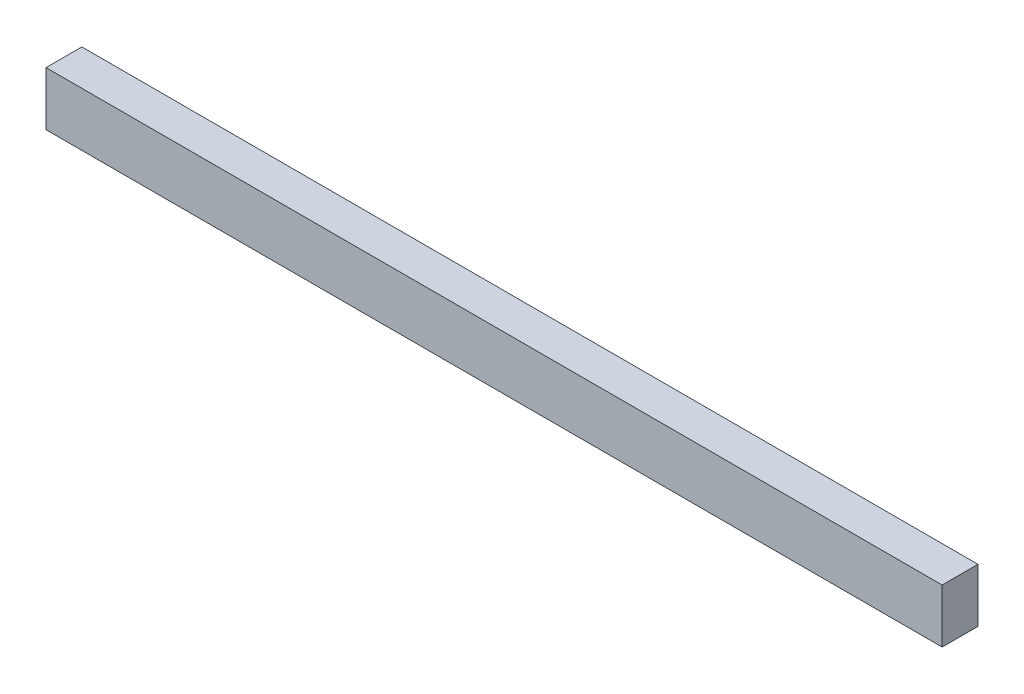
ISO-10303-21;
HEADER;
FILE_DESCRIPTION(('STEP AP214'),'2;1');
FILE_NAME('part.step','',(''),(''),'','','');
FILE_SCHEMA(('AUTOMOTIVE_DESIGN { 1 0 10303 214 1 1 1 1 }'));
ENDSEC;
DATA;
#1=APPLICATION_CONTEXT('core data for automotive mechanical design processes');
#2=APPLICATION_PROTOCOL_DEFINITION('international standard','automotive_design',2000,#1);
#3=PRODUCT_CONTEXT('',#1,'mechanical');
#4=PRODUCT('Part','Part','',(#3));
#5=PRODUCT_RELATED_PRODUCT_CATEGORY('part','',(#4));
#6=PRODUCT_DEFINITION_FORMATION('','',#4);
#7=PRODUCT_DEFINITION_CONTEXT('part definition',#1,'design');
#8=PRODUCT_DEFINITION('design','',#6,#7);
#9=PRODUCT_DEFINITION_SHAPE('','',#8);
#10=(LENGTH_UNIT() NAMED_UNIT(*) SI_UNIT(.MILLI.,.METRE.));
#11=(NAMED_UNIT(*) PLANE_ANGLE_UNIT() SI_UNIT($,.RADIAN.));
#12=(NAMED_UNIT(*) SI_UNIT($,.STERADIAN.) SOLID_ANGLE_UNIT());
#13=UNCERTAINTY_MEASURE_WITH_UNIT(LENGTH_MEASURE(1.E-05),#10,'distance_accuracy_value','');
#14=(GEOMETRIC_REPRESENTATION_CONTEXT(3) GLOBAL_UNCERTAINTY_ASSIGNED_CONTEXT((#13)) GLOBAL_UNIT_ASSIGNED_CONTEXT((#10,
#11,#12)) REPRESENTATION_CONTEXT('',''));
#15=CARTESIAN_POINT('',(0.,0.,0.));
#16=DIRECTION('',(0.,0.,1.));
#17=DIRECTION('',(1.,0.,0.));
#18=AXIS2_PLACEMENT_3D('',#15,#16,#17);
#19=CARTESIAN_POINT('',(0.,1.5,1.));
#20=DIRECTION('',(0.,1.,0.));
#21=DIRECTION('',(0.,0.,1.));
#22=AXIS2_PLACEMENT_3D('',#19,#20,#21);
#23=PLANE('',#22);
#24=DIRECTION('',(1.,0.,0.));
#25=VECTOR('',#24,1.);
#26=CARTESIAN_POINT('',(0.,1.5,0.));
#27=LINE('',#26,#25);
#28=CARTESIAN_POINT('',(0.,1.5,0.));
#29=VERTEX_POINT('',#28);
#30=CARTESIAN_POINT('',(25.,1.5,0.));
#31=VERTEX_POINT('',#30);
#32=EDGE_CURVE('E96',#29,#31,#27,.T.);
#33=ORIENTED_EDGE('',*,*,#32,.F.);
#34=DIRECTION('',(0.,0.,-1.));
#35=VECTOR('',#34,1.);
#36=CARTESIAN_POINT('',(0.,1.5,1.));
#37=LINE('',#36,#35);
#38=CARTESIAN_POINT('',(0.,1.5,1.));
#39=VERTEX_POINT('',#38);
#40=EDGE_CURVE('E11',#39,#29,#37,.T.);
#41=ORIENTED_EDGE('',*,*,#40,.F.);
#42=DIRECTION('',(1.,0.,0.));
#43=VECTOR('',#42,1.);
#44=CARTESIAN_POINT('',(0.,1.5,1.));
#45=LINE('',#44,#43);
#46=CARTESIAN_POINT('',(25.,1.5,1.));
#47=VERTEX_POINT('',#46);
#48=EDGE_CURVE('E90',#39,#47,#45,.T.);
#49=ORIENTED_EDGE('',*,*,#48,.T.);
#50=DIRECTION('',(0.,0.,-1.));
#51=VECTOR('',#50,1.);
#52=CARTESIAN_POINT('',(25.,1.5,1.));
#53=LINE('',#52,#51);
#54=EDGE_CURVE('E35',#47,#31,#53,.T.);
#55=ORIENTED_EDGE('',*,*,#54,.T.);
#56=EDGE_LOOP('',(#33,#41,#49,#55));
#57=FACE_BOUND('',#56,.T.);
#58=ADVANCED_FACE('F32',(#57),#23,.T.);
#59=CARTESIAN_POINT('',(0.,0.,1.));
#60=DIRECTION('',(-1.,0.,0.));
#61=DIRECTION('',(0.,0.,1.));
#62=AXIS2_PLACEMENT_3D('',#59,#60,#61);
#63=PLANE('',#62);
#64=DIRECTION('',(0.,1.,0.));
#65=VECTOR('',#64,1.);
#66=CARTESIAN_POINT('',(0.,0.,0.));
#67=LINE('',#66,#65);
#68=CARTESIAN_POINT('',(0.,0.,0.));
#69=VERTEX_POINT('',#68);
#70=EDGE_CURVE('E92',#69,#29,#67,.T.);
#71=ORIENTED_EDGE('',*,*,#70,.F.);
#72=DIRECTION('',(0.,0.,-1.));
#73=VECTOR('',#72,1.);
#74=CARTESIAN_POINT('',(0.,0.,1.));
#75=LINE('',#74,#73);
#76=CARTESIAN_POINT('',(0.,0.,1.));
#77=VERTEX_POINT('',#76);
#78=EDGE_CURVE('E41',#77,#69,#75,.T.);
#79=ORIENTED_EDGE('',*,*,#78,.F.);
#80=DIRECTION('',(0.,1.,0.));
#81=VECTOR('',#80,1.);
#82=CARTESIAN_POINT('',(0.,0.,1.));
#83=LINE('',#82,#81);
#84=EDGE_CURVE('E80',#77,#39,#83,.T.);
#85=ORIENTED_EDGE('',*,*,#84,.T.);
#86=ORIENTED_EDGE('',*,*,#40,.T.);
#87=EDGE_LOOP('',(#71,#79,#85,#86));
#88=FACE_BOUND('',#87,.T.);
#89=ADVANCED_FACE('F106',(#88),#63,.T.);
#90=CARTESIAN_POINT('',(0.,0.,1.));
#91=DIRECTION('',(0.,1.,0.));
#92=DIRECTION('',(0.,0.,1.));
#93=AXIS2_PLACEMENT_3D('',#90,#91,#92);
#94=PLANE('',#93);
#95=DIRECTION('',(1.,0.,0.));
#96=VECTOR('',#95,1.);
#97=CARTESIAN_POINT('',(0.,0.,0.));
#98=LINE('',#97,#96);
#99=CARTESIAN_POINT('',(25.,0.,0.));
#100=VERTEX_POINT('',#99);
#101=EDGE_CURVE('E85',#69,#100,#98,.T.);
#102=ORIENTED_EDGE('',*,*,#101,.T.);
#103=DIRECTION('',(0.,0.,-1.));
#104=VECTOR('',#103,1.);
#105=CARTESIAN_POINT('',(25.,0.,1.));
#106=LINE('',#105,#104);
#107=CARTESIAN_POINT('',(25.,0.,1.));
#108=VERTEX_POINT('',#107);
#109=EDGE_CURVE('E83',#108,#100,#106,.T.);
#110=ORIENTED_EDGE('',*,*,#109,.F.);
#111=DIRECTION('',(1.,0.,0.));
#112=VECTOR('',#111,1.);
#113=CARTESIAN_POINT('',(0.,0.,1.));
#114=LINE('',#113,#112);
#115=EDGE_CURVE('E77',#77,#108,#114,.T.);
#116=ORIENTED_EDGE('',*,*,#115,.F.);
#117=ORIENTED_EDGE('',*,*,#78,.T.);
#118=EDGE_LOOP('',(#102,#110,#116,#117));
#119=FACE_BOUND('',#118,.T.);
#120=ADVANCED_FACE('F84',(#119),#94,.F.);
#121=CARTESIAN_POINT('',(25.,0.,1.));
#122=DIRECTION('',(-1.,0.,0.));
#123=DIRECTION('',(0.,0.,1.));
#124=AXIS2_PLACEMENT_3D('',#121,#122,#123);
#125=PLANE('',#124);
#126=DIRECTION('',(0.,1.,0.));
#127=VECTOR('',#126,1.);
#128=CARTESIAN_POINT('',(25.,0.,0.));
#129=LINE('',#128,#127);
#130=EDGE_CURVE('E99',#100,#31,#129,.T.);
#131=ORIENTED_EDGE('',*,*,#130,.T.);
#132=ORIENTED_EDGE('',*,*,#54,.F.);
#133=DIRECTION('',(0.,1.,0.));
#134=VECTOR('',#133,1.);
#135=CARTESIAN_POINT('',(25.,0.,1.));
#136=LINE('',#135,#134);
#137=EDGE_CURVE('E74',#108,#47,#136,.T.);
#138=ORIENTED_EDGE('',*,*,#137,.F.);
#139=ORIENTED_EDGE('',*,*,#109,.T.);
#140=EDGE_LOOP('',(#131,#132,#138,#139));
#141=FACE_BOUND('',#140,.T.);
#142=ADVANCED_FACE('F89',(#141),#125,.F.);
#143=CARTESIAN_POINT('',(0.,0.,1.));
#144=DIRECTION('',(0.,0.,1.));
#145=DIRECTION('',(1.,0.,0.));
#146=AXIS2_PLACEMENT_3D('',#143,#144,#145);
#147=PLANE('',#146);
#148=ORIENTED_EDGE('',*,*,#48,.F.);
#149=ORIENTED_EDGE('',*,*,#84,.F.);
#150=ORIENTED_EDGE('',*,*,#115,.T.);
#151=ORIENTED_EDGE('',*,*,#137,.T.);
#152=EDGE_LOOP('',(#148,#149,#150,#151));
#153=FACE_BOUND('',#152,.T.);
#154=ADVANCED_FACE('F79',(#153),#147,.T.);
#155=CARTESIAN_POINT('',(0.,0.,0.));
#156=DIRECTION('',(0.,0.,1.));
#157=DIRECTION('',(1.,0.,0.));
#158=AXIS2_PLACEMENT_3D('',#155,#156,#157);
#159=PLANE('',#158);
#160=ORIENTED_EDGE('',*,*,#32,.T.);
#161=ORIENTED_EDGE('',*,*,#130,.F.);
#162=ORIENTED_EDGE('',*,*,#101,.F.);
#163=ORIENTED_EDGE('',*,*,#70,.T.);
#164=EDGE_LOOP('',(#160,#161,#162,#163));
#165=FACE_BOUND('',#164,.T.);
#166=ADVANCED_FACE('F105',(#165),#159,.F.);
#167=CLOSED_SHELL('',(#58,#89,#120,#142,#154,#166));
#168=MANIFOLD_SOLID_BREP('B2',#167);
#169=ADVANCED_BREP_SHAPE_REPRESENTATION('',(#18,#168),#14);
#170=SHAPE_DEFINITION_REPRESENTATION(#9,#169);
ENDSEC;
END-ISO-10303-21;
